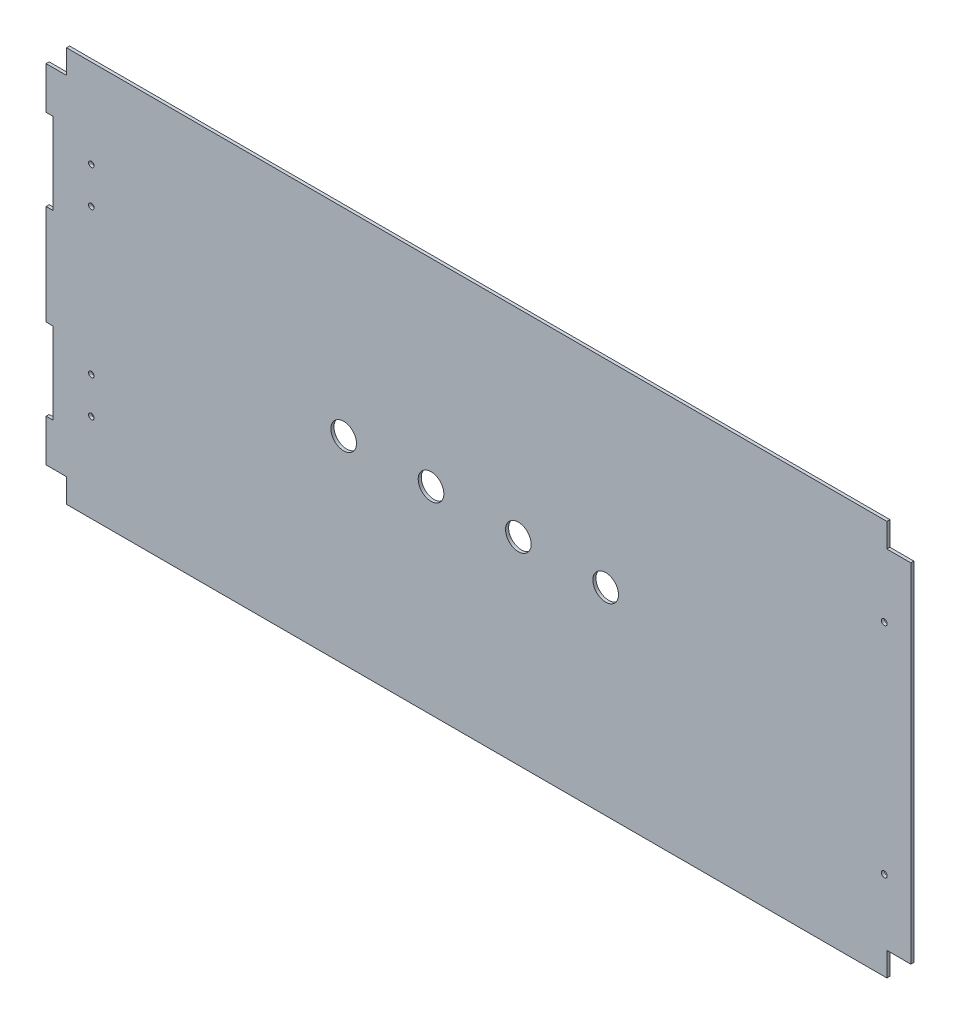
ISO-10303-21;
HEADER;
FILE_DESCRIPTION(('STEP AP214'),'2;1');
FILE_NAME('part.step','',(''),(''),'','','');
FILE_SCHEMA(('AUTOMOTIVE_DESIGN { 1 0 10303 214 1 1 1 1 }'));
ENDSEC;
DATA;
#1=APPLICATION_CONTEXT('core data for automotive mechanical design processes');
#2=APPLICATION_PROTOCOL_DEFINITION('international standard','automotive_design',2000,#1);
#3=PRODUCT_CONTEXT('',#1,'mechanical');
#4=PRODUCT('Part','Part','',(#3));
#5=PRODUCT_RELATED_PRODUCT_CATEGORY('part','',(#4));
#6=PRODUCT_DEFINITION_FORMATION('','',#4);
#7=PRODUCT_DEFINITION_CONTEXT('part definition',#1,'design');
#8=PRODUCT_DEFINITION('design','',#6,#7);
#9=PRODUCT_DEFINITION_SHAPE('','',#8);
#10=(LENGTH_UNIT() NAMED_UNIT(*) SI_UNIT(.MILLI.,.METRE.));
#11=(NAMED_UNIT(*) PLANE_ANGLE_UNIT() SI_UNIT($,.RADIAN.));
#12=(NAMED_UNIT(*) SI_UNIT($,.STERADIAN.) SOLID_ANGLE_UNIT());
#13=UNCERTAINTY_MEASURE_WITH_UNIT(LENGTH_MEASURE(1.E-05),#10,'distance_accuracy_value','');
#14=(GEOMETRIC_REPRESENTATION_CONTEXT(3) GLOBAL_UNCERTAINTY_ASSIGNED_CONTEXT((#13)) GLOBAL_UNIT_ASSIGNED_CONTEXT((#10,
#11,#12)) REPRESENTATION_CONTEXT('',''));
#15=CARTESIAN_POINT('',(0.,0.,0.));
#16=DIRECTION('',(0.,0.,1.));
#17=DIRECTION('',(1.,0.,0.));
#18=AXIS2_PLACEMENT_3D('',#15,#16,#17);
#19=CARTESIAN_POINT('',(0.,0.,-2.667));
#20=DIRECTION('',(0.,0.,-1.));
#21=DIRECTION('',(-1.,0.,0.));
#22=AXIS2_PLACEMENT_3D('',#19,#20,#21);
#23=PLANE('',#22);
#24=CARTESIAN_POINT('',(357.251,-95.25,-2.667));
#25=DIRECTION('',(0.,0.,1.));
#26=DIRECTION('',(1.,0.,0.));
#27=AXIS2_PLACEMENT_3D('',#24,#25,#26);
#28=CIRCLE('',#27,2.54000000000001);
#29=CARTESIAN_POINT('',(359.791,-95.25,-2.667));
#30=VERTEX_POINT('',#29);
#31=EDGE_CURVE('E415',#30,#30,#28,.T.);
#32=ORIENTED_EDGE('',*,*,#31,.T.);
#33=EDGE_LOOP('',(#32));
#34=FACE_BOUND('',#33,.T.);
#35=CARTESIAN_POINT('',(-334.645,-63.5,-2.667));
#36=DIRECTION('',(0.,0.,1.));
#37=DIRECTION('',(1.,0.,0.));
#38=AXIS2_PLACEMENT_3D('',#35,#36,#37);
#39=CIRCLE('',#38,2.41299999999999);
#40=CARTESIAN_POINT('',(-332.232,-63.5,-2.667));
#41=VERTEX_POINT('',#40);
#42=EDGE_CURVE('E402',#41,#41,#39,.T.);
#43=ORIENTED_EDGE('',*,*,#42,.T.);
#44=EDGE_LOOP('',(#43));
#45=FACE_BOUND('',#44,.T.);
#46=CARTESIAN_POINT('',(-334.645,63.5,-2.667));
#47=DIRECTION('',(0.,0.,1.));
#48=DIRECTION('',(1.,0.,0.));
#49=AXIS2_PLACEMENT_3D('',#46,#47,#48);
#50=CIRCLE('',#49,2.41299999999999);
#51=CARTESIAN_POINT('',(-332.232,63.5,-2.667));
#52=VERTEX_POINT('',#51);
#53=EDGE_CURVE('E403',#52,#52,#50,.T.);
#54=ORIENTED_EDGE('',*,*,#53,.T.);
#55=EDGE_LOOP('',(#54));
#56=FACE_BOUND('',#55,.T.);
#57=CARTESIAN_POINT('',(-334.645,-95.25,-2.667));
#58=DIRECTION('',(0.,0.,1.));
#59=DIRECTION('',(1.,0.,0.));
#60=AXIS2_PLACEMENT_3D('',#57,#58,#59);
#61=CIRCLE('',#60,2.41299999999999);
#62=CARTESIAN_POINT('',(-332.232,-95.25,-2.667));
#63=VERTEX_POINT('',#62);
#64=EDGE_CURVE('E396',#63,#63,#61,.T.);
#65=ORIENTED_EDGE('',*,*,#64,.T.);
#66=EDGE_LOOP('',(#65));
#67=FACE_BOUND('',#66,.T.);
#68=CARTESIAN_POINT('',(357.251,95.2499999999999,-2.667));
#69=DIRECTION('',(0.,0.,1.));
#70=DIRECTION('',(1.,0.,0.));
#71=AXIS2_PLACEMENT_3D('',#68,#69,#70);
#72=CIRCLE('',#71,2.54000000000001);
#73=CARTESIAN_POINT('',(359.791,95.2499999999999,-2.667));
#74=VERTEX_POINT('',#73);
#75=EDGE_CURVE('E414',#74,#74,#72,.T.);
#76=ORIENTED_EDGE('',*,*,#75,.T.);
#77=EDGE_LOOP('',(#76));
#78=FACE_BOUND('',#77,.T.);
#79=CARTESIAN_POINT('',(114.173,0.,-2.667));
#80=DIRECTION('',(0.,0.,1.));
#81=DIRECTION('',(1.,0.,0.));
#82=AXIS2_PLACEMENT_3D('',#79,#80,#81);
#83=CIRCLE('',#82,11.176);
#84=CARTESIAN_POINT('',(125.349,0.,-2.667));
#85=VERTEX_POINT('',#84);
#86=EDGE_CURVE('E439',#85,#85,#83,.T.);
#87=ORIENTED_EDGE('',*,*,#86,.T.);
#88=EDGE_LOOP('',(#87));
#89=FACE_BOUND('',#88,.T.);
#90=CARTESIAN_POINT('',(37.9729999999999,0.,-2.667));
#91=DIRECTION('',(0.,0.,1.));
#92=DIRECTION('',(1.,0.,0.));
#93=AXIS2_PLACEMENT_3D('',#90,#91,#92);
#94=CIRCLE('',#93,11.176);
#95=CARTESIAN_POINT('',(49.1489999999999,0.,-2.667));
#96=VERTEX_POINT('',#95);
#97=EDGE_CURVE('E433',#96,#96,#94,.T.);
#98=ORIENTED_EDGE('',*,*,#97,.T.);
#99=EDGE_LOOP('',(#98));
#100=FACE_BOUND('',#99,.T.);
#101=CARTESIAN_POINT('',(-38.2270000000001,0.,-2.667));
#102=DIRECTION('',(0.,0.,1.));
#103=DIRECTION('',(1.,0.,0.));
#104=AXIS2_PLACEMENT_3D('',#101,#102,#103);
#105=CIRCLE('',#104,11.176);
#106=CARTESIAN_POINT('',(-27.0510000000001,0.,-2.667));
#107=VERTEX_POINT('',#106);
#108=EDGE_CURVE('E427',#107,#107,#105,.T.);
#109=ORIENTED_EDGE('',*,*,#108,.T.);
#110=EDGE_LOOP('',(#109));
#111=FACE_BOUND('',#110,.T.);
#112=CARTESIAN_POINT('',(-334.645,95.25,-2.667));
#113=DIRECTION('',(0.,0.,1.));
#114=DIRECTION('',(1.,0.,0.));
#115=AXIS2_PLACEMENT_3D('',#112,#113,#114);
#116=CIRCLE('',#115,2.41299999999999);
#117=CARTESIAN_POINT('',(-332.232,95.25,-2.667));
#118=VERTEX_POINT('',#117);
#119=EDGE_CURVE('E328',#118,#118,#116,.T.);
#120=ORIENTED_EDGE('',*,*,#119,.T.);
#121=EDGE_LOOP('',(#120));
#122=FACE_BOUND('',#121,.T.);
#123=CARTESIAN_POINT('',(-114.427,0.,-2.667));
#124=DIRECTION('',(0.,0.,1.));
#125=DIRECTION('',(1.,0.,0.));
#126=AXIS2_PLACEMENT_3D('',#123,#124,#125);
#127=CIRCLE('',#126,11.176);
#128=CARTESIAN_POINT('',(-103.251,0.,-2.667));
#129=VERTEX_POINT('',#128);
#130=EDGE_CURVE('E447',#129,#129,#127,.T.);
#131=ORIENTED_EDGE('',*,*,#130,.T.);
#132=EDGE_LOOP('',(#131));
#133=FACE_BOUND('',#132,.T.);
#134=DIRECTION('',(1.,0.,0.));
#135=VECTOR('',#134,1.);
#136=CARTESIAN_POINT('',(-365.887,-151.638,-2.667));
#137=LINE('',#136,#135);
#138=CARTESIAN_POINT('',(-374.075577336074,-151.638,-2.66699999999992));
#139=VERTEX_POINT('',#138);
#140=CARTESIAN_POINT('',(-356.235,-151.638,-2.667));
#141=VERTEX_POINT('',#140);
#142=EDGE_CURVE('E149',#139,#141,#137,.T.);
#143=ORIENTED_EDGE('',*,*,#142,.F.);
#144=DIRECTION('',(0.,-1.,0.));
#145=VECTOR('',#144,1.);
#146=CARTESIAN_POINT('',(-374.075577336074,0.,-2.66699999999992));
#147=LINE('',#146,#145);
#148=CARTESIAN_POINT('',(-374.075577336074,-114.808,-2.66699999999992));
#149=VERTEX_POINT('',#148);
#150=EDGE_CURVE('E333',#139,#149,#147,.F.);
#151=ORIENTED_EDGE('',*,*,#150,.T.);
#152=DIRECTION('',(1.,0.,0.));
#153=VECTOR('',#152,1.);
#154=CARTESIAN_POINT('',(-374.075577336074,-114.808,-2.66699999999992));
#155=LINE('',#154,#153);
#156=CARTESIAN_POINT('',(-368.233577336074,-114.808,-2.66699999999997));
#157=VERTEX_POINT('',#156);
#158=EDGE_CURVE('E336',#149,#157,#155,.T.);
#159=ORIENTED_EDGE('',*,*,#158,.T.);
#160=DIRECTION('',(0.,1.,0.));
#161=VECTOR('',#160,1.);
#162=CARTESIAN_POINT('',(-368.233577336074,-43.6880000000001,-2.66699999999997));
#163=LINE('',#162,#161);
#164=CARTESIAN_POINT('',(-368.233577336074,-43.6880000000001,-2.66699999999997));
#165=VERTEX_POINT('',#164);
#166=EDGE_CURVE('E341',#157,#165,#163,.T.);
#167=ORIENTED_EDGE('',*,*,#166,.T.);
#168=DIRECTION('',(-1.,0.,0.));
#169=VECTOR('',#168,1.);
#170=CARTESIAN_POINT('',(-374.075577336074,-43.6880000000001,-2.66699999999992));
#171=LINE('',#170,#169);
#172=CARTESIAN_POINT('',(-374.075577336074,-43.6880000000001,-2.66699999999992));
#173=VERTEX_POINT('',#172);
#174=EDGE_CURVE('E338',#165,#173,#171,.T.);
#175=ORIENTED_EDGE('',*,*,#174,.T.);
#176=CARTESIAN_POINT('',(-374.075577336074,43.6879999999999,-2.66699999999992));
#177=VERTEX_POINT('',#176);
#178=EDGE_CURVE('E332',#173,#177,#147,.F.);
#179=ORIENTED_EDGE('',*,*,#178,.T.);
#180=DIRECTION('',(1.,0.,0.));
#181=VECTOR('',#180,1.);
#182=CARTESIAN_POINT('',(-374.075577336074,43.6879999999999,-2.66699999999992));
#183=LINE('',#182,#181);
#184=CARTESIAN_POINT('',(-368.233577336074,43.6879999999999,-2.66699999999997));
#185=VERTEX_POINT('',#184);
#186=EDGE_CURVE('E329',#177,#185,#183,.T.);
#187=ORIENTED_EDGE('',*,*,#186,.T.);
#188=DIRECTION('',(0.,1.,0.));
#189=VECTOR('',#188,1.);
#190=CARTESIAN_POINT('',(-368.233577336074,114.808,-2.66699999999997));
#191=LINE('',#190,#189);
#192=CARTESIAN_POINT('',(-368.233577336074,114.808,-2.66699999999997));
#193=VERTEX_POINT('',#192);
#194=EDGE_CURVE('E349',#185,#193,#191,.T.);
#195=ORIENTED_EDGE('',*,*,#194,.T.);
#196=DIRECTION('',(-1.,0.,0.));
#197=VECTOR('',#196,1.);
#198=CARTESIAN_POINT('',(-374.075577336074,114.808,-2.66699999999992));
#199=LINE('',#198,#197);
#200=CARTESIAN_POINT('',(-374.075577336074,114.808,-2.66699999999992));
#201=VERTEX_POINT('',#200);
#202=EDGE_CURVE('E346',#193,#201,#199,.T.);
#203=ORIENTED_EDGE('',*,*,#202,.T.);
#204=CARTESIAN_POINT('',(-374.075577336074,151.638,-2.66699999999992));
#205=VERTEX_POINT('',#204);
#206=EDGE_CURVE('E337',#201,#205,#147,.F.);
#207=ORIENTED_EDGE('',*,*,#206,.T.);
#208=DIRECTION('',(-1.,0.,0.));
#209=VECTOR('',#208,1.);
#210=CARTESIAN_POINT('',(-365.887,151.638,-2.667));
#211=LINE('',#210,#209);
#212=CARTESIAN_POINT('',(-356.235,151.638,-2.667));
#213=VERTEX_POINT('',#212);
#214=EDGE_CURVE('E463',#213,#205,#211,.T.);
#215=ORIENTED_EDGE('',*,*,#214,.F.);
#216=DIRECTION('',(0.,-1.,0.));
#217=VECTOR('',#216,1.);
#218=CARTESIAN_POINT('',(-356.235,157.988,-2.667));
#219=LINE('',#218,#217);
#220=CARTESIAN_POINT('',(-356.235,172.526577336074,-2.66699999999992));
#221=VERTEX_POINT('',#220);
#222=EDGE_CURVE('E461',#221,#213,#219,.T.);
#223=ORIENTED_EDGE('',*,*,#222,.F.);
#224=DIRECTION('',(-1.,0.,0.));
#225=VECTOR('',#224,1.);
#226=CARTESIAN_POINT('',(0.,172.526577336074,-2.66699999999992));
#227=LINE('',#226,#225);
#228=CARTESIAN_POINT('',(359.537,172.526577336074,-2.66699999999992));
#229=VERTEX_POINT('',#228);
#230=EDGE_CURVE('E293',#221,#229,#227,.F.);
#231=ORIENTED_EDGE('',*,*,#230,.T.);
#232=DIRECTION('',(0.,1.,0.));
#233=VECTOR('',#232,1.);
#234=CARTESIAN_POINT('',(359.537,157.988,-2.667));
#235=LINE('',#234,#233);
#236=CARTESIAN_POINT('',(359.537,151.638,-2.667));
#237=VERTEX_POINT('',#236);
#238=EDGE_CURVE('E289',#237,#229,#235,.T.);
#239=ORIENTED_EDGE('',*,*,#238,.F.);
#240=DIRECTION('',(-1.,0.,0.));
#241=VECTOR('',#240,1.);
#242=CARTESIAN_POINT('',(365.887,151.638,-2.667));
#243=LINE('',#242,#241);
#244=CARTESIAN_POINT('',(380.425577336074,151.638,-2.66699999999986));
#245=VERTEX_POINT('',#244);
#246=EDGE_CURVE('E458',#245,#237,#243,.T.);
#247=ORIENTED_EDGE('',*,*,#246,.F.);
#248=DIRECTION('',(0.,-1.,0.));
#249=VECTOR('',#248,1.);
#250=CARTESIAN_POINT('',(380.425577336074,0.,-2.66699999999986));
#251=LINE('',#250,#249);
#252=CARTESIAN_POINT('',(380.425577336074,-151.638,-2.66699999999986));
#253=VERTEX_POINT('',#252);
#254=EDGE_CURVE('E318',#245,#253,#251,.T.);
#255=ORIENTED_EDGE('',*,*,#254,.T.);
#256=DIRECTION('',(1.,0.,0.));
#257=VECTOR('',#256,1.);
#258=CARTESIAN_POINT('',(365.887,-151.638,-2.667));
#259=LINE('',#258,#257);
#260=CARTESIAN_POINT('',(359.537,-151.638,-2.667));
#261=VERTEX_POINT('',#260);
#262=EDGE_CURVE('E456',#261,#253,#259,.T.);
#263=ORIENTED_EDGE('',*,*,#262,.F.);
#264=DIRECTION('',(0.,1.,0.));
#265=VECTOR('',#264,1.);
#266=CARTESIAN_POINT('',(359.537,-157.988,-2.667));
#267=LINE('',#266,#265);
#268=CARTESIAN_POINT('',(359.537,-172.526577336074,-2.66699999999995));
#269=VERTEX_POINT('',#268);
#270=EDGE_CURVE('E182',#269,#261,#267,.T.);
#271=ORIENTED_EDGE('',*,*,#270,.F.);
#272=DIRECTION('',(-1.,0.,0.));
#273=VECTOR('',#272,1.);
#274=CARTESIAN_POINT('',(0.,-172.526577336074,-2.66699999999997));
#275=LINE('',#274,#273);
#276=CARTESIAN_POINT('',(-356.235,-172.526577336074,-2.667));
#277=VERTEX_POINT('',#276);
#278=EDGE_CURVE('E305',#269,#277,#275,.T.);
#279=ORIENTED_EDGE('',*,*,#278,.T.);
#280=DIRECTION('',(0.,-1.,0.));
#281=VECTOR('',#280,1.);
#282=CARTESIAN_POINT('',(-356.235,-157.988,-2.667));
#283=LINE('',#282,#281);
#284=EDGE_CURVE('E453',#141,#277,#283,.T.);
#285=ORIENTED_EDGE('',*,*,#284,.F.);
#286=EDGE_LOOP('',(#143,#151,#159,#167,#175,#179,#187,#195,#203,#207,#215,#223,#231,#239,#247,
#255,#263,#271,#279,#285));
#287=FACE_BOUND('',#286,.T.);
#288=ADVANCED_FACE('F131',(#34,#45,#56,#67,#78,#89,#100,#111,#122,#133,#287),#23,.T.);
#289=CARTESIAN_POINT('',(0.,0.,0.));
#290=DIRECTION('',(0.,0.,-1.));
#291=DIRECTION('',(-1.,0.,0.));
#292=AXIS2_PLACEMENT_3D('',#289,#290,#291);
#293=PLANE('',#292);
#294=CARTESIAN_POINT('',(357.251,-95.25,0.));
#295=DIRECTION('',(0.,0.,1.));
#296=DIRECTION('',(1.,0.,0.));
#297=AXIS2_PLACEMENT_3D('',#294,#295,#296);
#298=CIRCLE('',#297,2.54000000000001);
#299=CARTESIAN_POINT('',(359.791,-95.25,0.));
#300=VERTEX_POINT('',#299);
#301=EDGE_CURVE('E411',#300,#300,#298,.T.);
#302=ORIENTED_EDGE('',*,*,#301,.F.);
#303=EDGE_LOOP('',(#302));
#304=FACE_BOUND('',#303,.T.);
#305=CARTESIAN_POINT('',(-334.645,-63.5,0.));
#306=DIRECTION('',(0.,0.,1.));
#307=DIRECTION('',(1.,0.,0.));
#308=AXIS2_PLACEMENT_3D('',#305,#306,#307);
#309=CIRCLE('',#308,2.41299999999999);
#310=CARTESIAN_POINT('',(-332.232,-63.5,0.));
#311=VERTEX_POINT('',#310);
#312=EDGE_CURVE('E418',#311,#311,#309,.T.);
#313=ORIENTED_EDGE('',*,*,#312,.F.);
#314=EDGE_LOOP('',(#313));
#315=FACE_BOUND('',#314,.T.);
#316=CARTESIAN_POINT('',(-334.645,63.5,0.));
#317=DIRECTION('',(0.,0.,1.));
#318=DIRECTION('',(1.,0.,0.));
#319=AXIS2_PLACEMENT_3D('',#316,#317,#318);
#320=CIRCLE('',#319,2.41299999999999);
#321=CARTESIAN_POINT('',(-332.232,63.5,0.));
#322=VERTEX_POINT('',#321);
#323=EDGE_CURVE('E399',#322,#322,#320,.T.);
#324=ORIENTED_EDGE('',*,*,#323,.F.);
#325=EDGE_LOOP('',(#324));
#326=FACE_BOUND('',#325,.T.);
#327=CARTESIAN_POINT('',(-334.645,-95.25,0.));
#328=DIRECTION('',(0.,0.,1.));
#329=DIRECTION('',(1.,0.,0.));
#330=AXIS2_PLACEMENT_3D('',#327,#328,#329);
#331=CIRCLE('',#330,2.41299999999999);
#332=CARTESIAN_POINT('',(-332.232,-95.25,0.));
#333=VERTEX_POINT('',#332);
#334=EDGE_CURVE('E406',#333,#333,#331,.T.);
#335=ORIENTED_EDGE('',*,*,#334,.F.);
#336=EDGE_LOOP('',(#335));
#337=FACE_BOUND('',#336,.T.);
#338=CARTESIAN_POINT('',(357.251,95.2499999999999,0.));
#339=DIRECTION('',(0.,0.,1.));
#340=DIRECTION('',(1.,0.,0.));
#341=AXIS2_PLACEMENT_3D('',#338,#339,#340);
#342=CIRCLE('',#341,2.54000000000001);
#343=CARTESIAN_POINT('',(359.791,95.2499999999999,0.));
#344=VERTEX_POINT('',#343);
#345=EDGE_CURVE('E442',#344,#344,#342,.T.);
#346=ORIENTED_EDGE('',*,*,#345,.F.);
#347=EDGE_LOOP('',(#346));
#348=FACE_BOUND('',#347,.T.);
#349=CARTESIAN_POINT('',(114.173,0.,0.));
#350=DIRECTION('',(0.,0.,1.));
#351=DIRECTION('',(1.,0.,0.));
#352=AXIS2_PLACEMENT_3D('',#349,#350,#351);
#353=CIRCLE('',#352,11.176);
#354=CARTESIAN_POINT('',(125.349,0.,0.));
#355=VERTEX_POINT('',#354);
#356=EDGE_CURVE('E436',#355,#355,#353,.T.);
#357=ORIENTED_EDGE('',*,*,#356,.F.);
#358=EDGE_LOOP('',(#357));
#359=FACE_BOUND('',#358,.T.);
#360=CARTESIAN_POINT('',(37.9729999999999,0.,0.));
#361=DIRECTION('',(0.,0.,1.));
#362=DIRECTION('',(1.,0.,0.));
#363=AXIS2_PLACEMENT_3D('',#360,#361,#362);
#364=CIRCLE('',#363,11.176);
#365=CARTESIAN_POINT('',(49.1489999999999,0.,0.));
#366=VERTEX_POINT('',#365);
#367=EDGE_CURVE('E430',#366,#366,#364,.T.);
#368=ORIENTED_EDGE('',*,*,#367,.F.);
#369=EDGE_LOOP('',(#368));
#370=FACE_BOUND('',#369,.T.);
#371=CARTESIAN_POINT('',(-38.2270000000001,0.,0.));
#372=DIRECTION('',(0.,0.,1.));
#373=DIRECTION('',(1.,0.,0.));
#374=AXIS2_PLACEMENT_3D('',#371,#372,#373);
#375=CIRCLE('',#374,11.176);
#376=CARTESIAN_POINT('',(-27.0510000000001,0.,0.));
#377=VERTEX_POINT('',#376);
#378=EDGE_CURVE('E423',#377,#377,#375,.T.);
#379=ORIENTED_EDGE('',*,*,#378,.F.);
#380=EDGE_LOOP('',(#379));
#381=FACE_BOUND('',#380,.T.);
#382=CARTESIAN_POINT('',(-334.645,95.25,0.));
#383=DIRECTION('',(0.,0.,1.));
#384=DIRECTION('',(1.,0.,0.));
#385=AXIS2_PLACEMENT_3D('',#382,#383,#384);
#386=CIRCLE('',#385,2.41299999999999);
#387=CARTESIAN_POINT('',(-332.232,95.25,0.));
#388=VERTEX_POINT('',#387);
#389=EDGE_CURVE('E393',#388,#388,#386,.T.);
#390=ORIENTED_EDGE('',*,*,#389,.F.);
#391=EDGE_LOOP('',(#390));
#392=FACE_BOUND('',#391,.T.);
#393=CARTESIAN_POINT('',(-114.427,0.,0.));
#394=DIRECTION('',(0.,0.,1.));
#395=DIRECTION('',(1.,0.,0.));
#396=AXIS2_PLACEMENT_3D('',#393,#394,#395);
#397=CIRCLE('',#396,11.176);
#398=CARTESIAN_POINT('',(-103.251,0.,0.));
#399=VERTEX_POINT('',#398);
#400=EDGE_CURVE('E426',#399,#399,#397,.T.);
#401=ORIENTED_EDGE('',*,*,#400,.F.);
#402=EDGE_LOOP('',(#401));
#403=FACE_BOUND('',#402,.T.);
#404=DIRECTION('',(-1.,0.,0.));
#405=VECTOR('',#404,1.);
#406=CARTESIAN_POINT('',(-365.887,151.638,0.));
#407=LINE('',#406,#405);
#408=CARTESIAN_POINT('',(-356.235,151.638,0.));
#409=VERTEX_POINT('',#408);
#410=CARTESIAN_POINT('',(-374.075577336074,151.638,0.));
#411=VERTEX_POINT('',#410);
#412=EDGE_CURVE('E473',#409,#411,#407,.T.);
#413=ORIENTED_EDGE('',*,*,#412,.T.);
#414=DIRECTION('',(0.,1.,0.));
#415=VECTOR('',#414,1.);
#416=CARTESIAN_POINT('',(-374.075577336074,151.638,0.));
#417=LINE('',#416,#415);
#418=CARTESIAN_POINT('',(-374.075577336074,114.808,0.));
#419=VERTEX_POINT('',#418);
#420=EDGE_CURVE('E364',#419,#411,#417,.T.);
#421=ORIENTED_EDGE('',*,*,#420,.F.);
#422=DIRECTION('',(-1.,0.,0.));
#423=VECTOR('',#422,1.);
#424=CARTESIAN_POINT('',(-374.075577336074,114.808,0.));
#425=LINE('',#424,#423);
#426=CARTESIAN_POINT('',(-368.233577336074,114.808,0.));
#427=VERTEX_POINT('',#426);
#428=EDGE_CURVE('E359',#427,#419,#425,.T.);
#429=ORIENTED_EDGE('',*,*,#428,.F.);
#430=DIRECTION('',(0.,1.,0.));
#431=VECTOR('',#430,1.);
#432=CARTESIAN_POINT('',(-368.233577336074,114.808,0.));
#433=LINE('',#432,#431);
#434=CARTESIAN_POINT('',(-368.233577336074,43.6879999999999,0.));
#435=VERTEX_POINT('',#434);
#436=EDGE_CURVE('E354',#435,#427,#433,.T.);
#437=ORIENTED_EDGE('',*,*,#436,.F.);
#438=DIRECTION('',(1.,0.,0.));
#439=VECTOR('',#438,1.);
#440=CARTESIAN_POINT('',(-374.075577336074,43.6879999999999,0.));
#441=LINE('',#440,#439);
#442=CARTESIAN_POINT('',(-374.075577336074,43.6879999999999,0.));
#443=VERTEX_POINT('',#442);
#444=EDGE_CURVE('E317',#443,#435,#441,.T.);
#445=ORIENTED_EDGE('',*,*,#444,.F.);
#446=CARTESIAN_POINT('',(-374.075577336074,-43.6880000000001,0.));
#447=VERTEX_POINT('',#446);
#448=EDGE_CURVE('E370',#447,#443,#417,.T.);
#449=ORIENTED_EDGE('',*,*,#448,.F.);
#450=DIRECTION('',(-1.,0.,0.));
#451=VECTOR('',#450,1.);
#452=CARTESIAN_POINT('',(-374.075577336074,-43.6880000000001,0.));
#453=LINE('',#452,#451);
#454=CARTESIAN_POINT('',(-368.233577336074,-43.6880000000001,0.));
#455=VERTEX_POINT('',#454);
#456=EDGE_CURVE('E384',#455,#447,#453,.T.);
#457=ORIENTED_EDGE('',*,*,#456,.F.);
#458=DIRECTION('',(0.,1.,0.));
#459=VECTOR('',#458,1.);
#460=CARTESIAN_POINT('',(-368.233577336074,-43.6880000000001,0.));
#461=LINE('',#460,#459);
#462=CARTESIAN_POINT('',(-368.233577336074,-114.808,0.));
#463=VERTEX_POINT('',#462);
#464=EDGE_CURVE('E379',#463,#455,#461,.T.);
#465=ORIENTED_EDGE('',*,*,#464,.F.);
#466=DIRECTION('',(1.,0.,0.));
#467=VECTOR('',#466,1.);
#468=CARTESIAN_POINT('',(-374.075577336074,-114.808,0.));
#469=LINE('',#468,#467);
#470=CARTESIAN_POINT('',(-374.075577336074,-114.808,0.));
#471=VERTEX_POINT('',#470);
#472=EDGE_CURVE('E374',#471,#463,#469,.T.);
#473=ORIENTED_EDGE('',*,*,#472,.F.);
#474=CARTESIAN_POINT('',(-374.075577336074,-151.638,0.));
#475=VERTEX_POINT('',#474);
#476=EDGE_CURVE('E365',#475,#471,#417,.T.);
#477=ORIENTED_EDGE('',*,*,#476,.F.);
#478=DIRECTION('',(1.,0.,0.));
#479=VECTOR('',#478,1.);
#480=CARTESIAN_POINT('',(-365.887,-151.638,0.));
#481=LINE('',#480,#479);
#482=CARTESIAN_POINT('',(-356.235,-151.638,0.));
#483=VERTEX_POINT('',#482);
#484=EDGE_CURVE('E175',#475,#483,#481,.T.);
#485=ORIENTED_EDGE('',*,*,#484,.T.);
#486=DIRECTION('',(0.,-1.,0.));
#487=VECTOR('',#486,1.);
#488=CARTESIAN_POINT('',(-356.235,-157.988,0.));
#489=LINE('',#488,#487);
#490=CARTESIAN_POINT('',(-356.235,-172.526577336074,0.));
#491=VERTEX_POINT('',#490);
#492=EDGE_CURVE('E450',#483,#491,#489,.T.);
#493=ORIENTED_EDGE('',*,*,#492,.T.);
#494=DIRECTION('',(1.,0.,0.));
#495=VECTOR('',#494,1.);
#496=CARTESIAN_POINT('',(359.537,-172.526577336074,0.));
#497=LINE('',#496,#495);
#498=CARTESIAN_POINT('',(359.537,-172.526577336074,0.));
#499=VERTEX_POINT('',#498);
#500=EDGE_CURVE('E311',#499,#491,#497,.F.);
#501=ORIENTED_EDGE('',*,*,#500,.F.);
#502=DIRECTION('',(0.,1.,0.));
#503=VECTOR('',#502,1.);
#504=CARTESIAN_POINT('',(359.537,-157.988,0.));
#505=LINE('',#504,#503);
#506=CARTESIAN_POINT('',(359.537,-151.638,0.));
#507=VERTEX_POINT('',#506);
#508=EDGE_CURVE('E467',#499,#507,#505,.T.);
#509=ORIENTED_EDGE('',*,*,#508,.T.);
#510=DIRECTION('',(1.,0.,0.));
#511=VECTOR('',#510,1.);
#512=CARTESIAN_POINT('',(365.887,-151.638,0.));
#513=LINE('',#512,#511);
#514=CARTESIAN_POINT('',(380.425577336074,-151.638,1.11022302462516E-13));
#515=VERTEX_POINT('',#514);
#516=EDGE_CURVE('E469',#507,#515,#513,.T.);
#517=ORIENTED_EDGE('',*,*,#516,.T.);
#518=DIRECTION('',(0.,1.,0.));
#519=VECTOR('',#518,1.);
#520=CARTESIAN_POINT('',(380.425577336074,151.638,1.11022302462516E-13));
#521=LINE('',#520,#519);
#522=CARTESIAN_POINT('',(380.425577336074,151.638,1.11022302462516E-13));
#523=VERTEX_POINT('',#522);
#524=EDGE_CURVE('E304',#523,#515,#521,.F.);
#525=ORIENTED_EDGE('',*,*,#524,.F.);
#526=DIRECTION('',(-1.,0.,0.));
#527=VECTOR('',#526,1.);
#528=CARTESIAN_POINT('',(365.887,151.638,0.));
#529=LINE('',#528,#527);
#530=CARTESIAN_POINT('',(359.537,151.638,0.));
#531=VERTEX_POINT('',#530);
#532=EDGE_CURVE('E280',#523,#531,#529,.T.);
#533=ORIENTED_EDGE('',*,*,#532,.T.);
#534=DIRECTION('',(0.,1.,0.));
#535=VECTOR('',#534,1.);
#536=CARTESIAN_POINT('',(359.537,157.988,0.));
#537=LINE('',#536,#535);
#538=CARTESIAN_POINT('',(359.537,172.526577336074,1.11022302462516E-13));
#539=VERTEX_POINT('',#538);
#540=EDGE_CURVE('E275',#531,#539,#537,.T.);
#541=ORIENTED_EDGE('',*,*,#540,.T.);
#542=DIRECTION('',(1.,0.,0.));
#543=VECTOR('',#542,1.);
#544=CARTESIAN_POINT('',(359.537,172.526577336074,1.11022302462516E-13));
#545=LINE('',#544,#543);
#546=CARTESIAN_POINT('',(-356.235,172.526577336074,0.));
#547=VERTEX_POINT('',#546);
#548=EDGE_CURVE('E278',#547,#539,#545,.T.);
#549=ORIENTED_EDGE('',*,*,#548,.F.);
#550=DIRECTION('',(0.,-1.,0.));
#551=VECTOR('',#550,1.);
#552=CARTESIAN_POINT('',(-356.235,157.988,0.));
#553=LINE('',#552,#551);
#554=EDGE_CURVE('E168',#547,#409,#553,.T.);
#555=ORIENTED_EDGE('',*,*,#554,.T.);
#556=EDGE_LOOP('',(#413,#421,#429,#437,#445,#449,#457,#465,#473,#477,#485,#493,#501,#509,#517,
#525,#533,#541,#549,#555));
#557=FACE_BOUND('',#556,.T.);
#558=ADVANCED_FACE('F133',(#304,#315,#326,#337,#348,#359,#370,#381,#392,#403,#557),#293,.F.);
#559=CARTESIAN_POINT('',(-365.887,151.638,-2.667));
#560=DIRECTION('',(0.,1.,0.));
#561=DIRECTION('',(-1.,0.,0.));
#562=AXIS2_PLACEMENT_3D('',#559,#560,#561);
#563=PLANE('',#562);
#564=ORIENTED_EDGE('',*,*,#214,.T.);
#565=DIRECTION('',(0.,0.,-1.));
#566=VECTOR('',#565,1.);
#567=CARTESIAN_POINT('',(-374.075577336074,151.638,0.));
#568=LINE('',#567,#566);
#569=EDGE_CURVE('E361',#411,#205,#568,.T.);
#570=ORIENTED_EDGE('',*,*,#569,.F.);
#571=ORIENTED_EDGE('',*,*,#412,.F.);
#572=DIRECTION('',(0.,0.,1.));
#573=VECTOR('',#572,1.);
#574=CARTESIAN_POINT('',(-356.235,151.638,-2.667));
#575=LINE('',#574,#573);
#576=EDGE_CURVE('E141',#213,#409,#575,.T.);
#577=ORIENTED_EDGE('',*,*,#576,.F.);
#578=EDGE_LOOP('',(#564,#570,#571,#577));
#579=FACE_BOUND('',#578,.T.);
#580=ADVANCED_FACE('F506',(#579),#563,.T.);
#581=CARTESIAN_POINT('',(365.887,-151.638,-2.667));
#582=DIRECTION('',(0.,-1.,0.));
#583=DIRECTION('',(0.,0.,-1.));
#584=AXIS2_PLACEMENT_3D('',#581,#582,#583);
#585=PLANE('',#584);
#586=ORIENTED_EDGE('',*,*,#262,.T.);
#587=DIRECTION('',(0.,0.,-1.));
#588=VECTOR('',#587,1.);
#589=CARTESIAN_POINT('',(380.425577336074,-151.638,1.11022302462516E-13));
#590=LINE('',#589,#588);
#591=EDGE_CURVE('E321',#515,#253,#590,.T.);
#592=ORIENTED_EDGE('',*,*,#591,.F.);
#593=ORIENTED_EDGE('',*,*,#516,.F.);
#594=DIRECTION('',(0.,0.,1.));
#595=VECTOR('',#594,1.);
#596=CARTESIAN_POINT('',(359.537,-151.638,-2.667));
#597=LINE('',#596,#595);
#598=EDGE_CURVE('E135',#261,#507,#597,.T.);
#599=ORIENTED_EDGE('',*,*,#598,.F.);
#600=EDGE_LOOP('',(#586,#592,#593,#599));
#601=FACE_BOUND('',#600,.T.);
#602=ADVANCED_FACE('F484',(#601),#585,.T.);
#603=CARTESIAN_POINT('',(-356.235,-157.988,-2.667));
#604=DIRECTION('',(-1.,0.,0.));
#605=DIRECTION('',(0.,0.,1.));
#606=AXIS2_PLACEMENT_3D('',#603,#604,#605);
#607=PLANE('',#606);
#608=ORIENTED_EDGE('',*,*,#284,.T.);
#609=DIRECTION('',(0.,0.,-1.));
#610=VECTOR('',#609,1.);
#611=CARTESIAN_POINT('',(-356.235,-172.526577336074,0.));
#612=LINE('',#611,#610);
#613=EDGE_CURVE('E308',#491,#277,#612,.T.);
#614=ORIENTED_EDGE('',*,*,#613,.F.);
#615=ORIENTED_EDGE('',*,*,#492,.F.);
#616=DIRECTION('',(0.,0.,1.));
#617=VECTOR('',#616,1.);
#618=CARTESIAN_POINT('',(-356.235,-151.638,-2.667));
#619=LINE('',#618,#617);
#620=EDGE_CURVE('E13',#141,#483,#619,.T.);
#621=ORIENTED_EDGE('',*,*,#620,.F.);
#622=EDGE_LOOP('',(#608,#614,#615,#621));
#623=FACE_BOUND('',#622,.T.);
#624=ADVANCED_FACE('F564',(#623),#607,.T.);
#625=CARTESIAN_POINT('',(359.537,157.988,-2.667));
#626=DIRECTION('',(1.,0.,0.));
#627=DIRECTION('',(0.,0.,-1.));
#628=AXIS2_PLACEMENT_3D('',#625,#626,#627);
#629=PLANE('',#628);
#630=ORIENTED_EDGE('',*,*,#238,.T.);
#631=DIRECTION('',(0.,0.,-1.));
#632=VECTOR('',#631,1.);
#633=CARTESIAN_POINT('',(359.537,172.526577336074,1.11022302462516E-13));
#634=LINE('',#633,#632);
#635=EDGE_CURVE('E286',#539,#229,#634,.T.);
#636=ORIENTED_EDGE('',*,*,#635,.F.);
#637=ORIENTED_EDGE('',*,*,#540,.F.);
#638=DIRECTION('',(0.,0.,1.));
#639=VECTOR('',#638,1.);
#640=CARTESIAN_POINT('',(359.537,151.638,-2.667));
#641=LINE('',#640,#639);
#642=EDGE_CURVE('E476',#237,#531,#641,.T.);
#643=ORIENTED_EDGE('',*,*,#642,.F.);
#644=EDGE_LOOP('',(#630,#636,#637,#643));
#645=FACE_BOUND('',#644,.T.);
#646=ADVANCED_FACE('F287',(#645),#629,.T.);
#647=CARTESIAN_POINT('',(-365.887,-151.638,-2.667));
#648=DIRECTION('',(0.,-1.,0.));
#649=DIRECTION('',(0.,0.,-1.));
#650=AXIS2_PLACEMENT_3D('',#647,#648,#649);
#651=PLANE('',#650);
#652=ORIENTED_EDGE('',*,*,#484,.F.);
#653=DIRECTION('',(0.,0.,-1.));
#654=VECTOR('',#653,1.);
#655=CARTESIAN_POINT('',(-374.075577336074,-151.638,0.));
#656=LINE('',#655,#654);
#657=EDGE_CURVE('E326',#475,#139,#656,.T.);
#658=ORIENTED_EDGE('',*,*,#657,.T.);
#659=ORIENTED_EDGE('',*,*,#142,.T.);
#660=ORIENTED_EDGE('',*,*,#620,.T.);
#661=EDGE_LOOP('',(#652,#658,#659,#660));
#662=FACE_BOUND('',#661,.T.);
#663=ADVANCED_FACE('F555',(#662),#651,.T.);
#664=CARTESIAN_POINT('',(-356.235,157.988,-2.667));
#665=DIRECTION('',(-1.,0.,0.));
#666=DIRECTION('',(0.,-1.,0.));
#667=AXIS2_PLACEMENT_3D('',#664,#665,#666);
#668=PLANE('',#667);
#669=ORIENTED_EDGE('',*,*,#554,.F.);
#670=DIRECTION('',(0.,0.,-1.));
#671=VECTOR('',#670,1.);
#672=CARTESIAN_POINT('',(-356.235,172.526577336074,0.));
#673=LINE('',#672,#671);
#674=EDGE_CURVE('E298',#547,#221,#673,.T.);
#675=ORIENTED_EDGE('',*,*,#674,.T.);
#676=ORIENTED_EDGE('',*,*,#222,.T.);
#677=ORIENTED_EDGE('',*,*,#576,.T.);
#678=EDGE_LOOP('',(#669,#675,#676,#677));
#679=FACE_BOUND('',#678,.T.);
#680=ADVANCED_FACE('F501',(#679),#668,.T.);
#681=CARTESIAN_POINT('',(365.887,151.638,-2.667));
#682=DIRECTION('',(0.,1.,0.));
#683=DIRECTION('',(0.,0.,1.));
#684=AXIS2_PLACEMENT_3D('',#681,#682,#683);
#685=PLANE('',#684);
#686=ORIENTED_EDGE('',*,*,#532,.F.);
#687=DIRECTION('',(0.,0.,-1.));
#688=VECTOR('',#687,1.);
#689=CARTESIAN_POINT('',(380.425577336074,151.638,1.11022302462516E-13));
#690=LINE('',#689,#688);
#691=EDGE_CURVE('E314',#523,#245,#690,.T.);
#692=ORIENTED_EDGE('',*,*,#691,.T.);
#693=ORIENTED_EDGE('',*,*,#246,.T.);
#694=ORIENTED_EDGE('',*,*,#642,.T.);
#695=EDGE_LOOP('',(#686,#692,#693,#694));
#696=FACE_BOUND('',#695,.T.);
#697=ADVANCED_FACE('F497',(#696),#685,.T.);
#698=CARTESIAN_POINT('',(359.537,-157.988,-2.667));
#699=DIRECTION('',(1.,0.,0.));
#700=DIRECTION('',(0.,0.,-1.));
#701=AXIS2_PLACEMENT_3D('',#698,#699,#700);
#702=PLANE('',#701);
#703=ORIENTED_EDGE('',*,*,#508,.F.);
#704=DIRECTION('',(0.,0.,-1.));
#705=VECTOR('',#704,1.);
#706=CARTESIAN_POINT('',(359.537,-172.526577336074,0.));
#707=LINE('',#706,#705);
#708=EDGE_CURVE('E302',#499,#269,#707,.T.);
#709=ORIENTED_EDGE('',*,*,#708,.T.);
#710=ORIENTED_EDGE('',*,*,#270,.T.);
#711=ORIENTED_EDGE('',*,*,#598,.T.);
#712=EDGE_LOOP('',(#703,#709,#710,#711));
#713=FACE_BOUND('',#712,.T.);
#714=ADVANCED_FACE('F479',(#713),#702,.T.);
#715=CARTESIAN_POINT('',(-114.427,0.,-2.667));
#716=DIRECTION('',(0.,0.,1.));
#717=DIRECTION('',(1.,0.,0.));
#718=AXIS2_PLACEMENT_3D('',#715,#716,#717);
#719=CYLINDRICAL_SURFACE('',#718,11.176);
#720=ORIENTED_EDGE('',*,*,#130,.F.);
#721=EDGE_LOOP('',(#720));
#722=FACE_BOUND('',#721,.T.);
#723=ORIENTED_EDGE('',*,*,#400,.T.);
#724=EDGE_LOOP('',(#723));
#725=FACE_BOUND('',#724,.T.);
#726=ADVANCED_FACE('F553',(#722,#725),#719,.F.);
#727=CARTESIAN_POINT('',(-334.645,95.25,-2.667));
#728=DIRECTION('',(0.,0.,1.));
#729=DIRECTION('',(1.,0.,0.));
#730=AXIS2_PLACEMENT_3D('',#727,#728,#729);
#731=CYLINDRICAL_SURFACE('',#730,2.41299999999999);
#732=ORIENTED_EDGE('',*,*,#119,.F.);
#733=EDGE_LOOP('',(#732));
#734=FACE_BOUND('',#733,.T.);
#735=ORIENTED_EDGE('',*,*,#389,.T.);
#736=EDGE_LOOP('',(#735));
#737=FACE_BOUND('',#736,.T.);
#738=ADVANCED_FACE('F809',(#734,#737),#731,.F.);
#739=CARTESIAN_POINT('',(-38.2270000000001,0.,-2.667));
#740=DIRECTION('',(0.,0.,1.));
#741=DIRECTION('',(1.,0.,0.));
#742=AXIS2_PLACEMENT_3D('',#739,#740,#741);
#743=CYLINDRICAL_SURFACE('',#742,11.176);
#744=ORIENTED_EDGE('',*,*,#108,.F.);
#745=EDGE_LOOP('',(#744));
#746=FACE_BOUND('',#745,.T.);
#747=ORIENTED_EDGE('',*,*,#378,.T.);
#748=EDGE_LOOP('',(#747));
#749=FACE_BOUND('',#748,.T.);
#750=ADVANCED_FACE('F817',(#746,#749),#743,.F.);
#751=CARTESIAN_POINT('',(37.9729999999999,0.,-2.667));
#752=DIRECTION('',(0.,0.,1.));
#753=DIRECTION('',(1.,0.,0.));
#754=AXIS2_PLACEMENT_3D('',#751,#752,#753);
#755=CYLINDRICAL_SURFACE('',#754,11.176);
#756=ORIENTED_EDGE('',*,*,#97,.F.);
#757=EDGE_LOOP('',(#756));
#758=FACE_BOUND('',#757,.T.);
#759=ORIENTED_EDGE('',*,*,#367,.T.);
#760=EDGE_LOOP('',(#759));
#761=FACE_BOUND('',#760,.T.);
#762=ADVANCED_FACE('F825',(#758,#761),#755,.F.);
#763=CARTESIAN_POINT('',(114.173,0.,-2.667));
#764=DIRECTION('',(0.,0.,1.));
#765=DIRECTION('',(1.,0.,0.));
#766=AXIS2_PLACEMENT_3D('',#763,#764,#765);
#767=CYLINDRICAL_SURFACE('',#766,11.176);
#768=ORIENTED_EDGE('',*,*,#86,.F.);
#769=EDGE_LOOP('',(#768));
#770=FACE_BOUND('',#769,.T.);
#771=ORIENTED_EDGE('',*,*,#356,.T.);
#772=EDGE_LOOP('',(#771));
#773=FACE_BOUND('',#772,.T.);
#774=ADVANCED_FACE('F834',(#770,#773),#767,.F.);
#775=CARTESIAN_POINT('',(357.251,95.2499999999999,-2.667));
#776=DIRECTION('',(0.,0.,1.));
#777=DIRECTION('',(1.,0.,0.));
#778=AXIS2_PLACEMENT_3D('',#775,#776,#777);
#779=CYLINDRICAL_SURFACE('',#778,2.54000000000001);
#780=ORIENTED_EDGE('',*,*,#75,.F.);
#781=EDGE_LOOP('',(#780));
#782=FACE_BOUND('',#781,.T.);
#783=ORIENTED_EDGE('',*,*,#345,.T.);
#784=EDGE_LOOP('',(#783));
#785=FACE_BOUND('',#784,.T.);
#786=ADVANCED_FACE('F843',(#782,#785),#779,.F.);
#787=CARTESIAN_POINT('',(-334.645,-95.25,-2.667));
#788=DIRECTION('',(0.,0.,1.));
#789=DIRECTION('',(1.,0.,0.));
#790=AXIS2_PLACEMENT_3D('',#787,#788,#789);
#791=CYLINDRICAL_SURFACE('',#790,2.41299999999999);
#792=ORIENTED_EDGE('',*,*,#64,.F.);
#793=EDGE_LOOP('',(#792));
#794=FACE_BOUND('',#793,.T.);
#795=ORIENTED_EDGE('',*,*,#334,.T.);
#796=EDGE_LOOP('',(#795));
#797=FACE_BOUND('',#796,.T.);
#798=ADVANCED_FACE('F852',(#794,#797),#791,.F.);
#799=CARTESIAN_POINT('',(-334.645,63.5,-2.667));
#800=DIRECTION('',(0.,0.,1.));
#801=DIRECTION('',(1.,0.,0.));
#802=AXIS2_PLACEMENT_3D('',#799,#800,#801);
#803=CYLINDRICAL_SURFACE('',#802,2.41299999999999);
#804=ORIENTED_EDGE('',*,*,#53,.F.);
#805=EDGE_LOOP('',(#804));
#806=FACE_BOUND('',#805,.T.);
#807=ORIENTED_EDGE('',*,*,#323,.T.);
#808=EDGE_LOOP('',(#807));
#809=FACE_BOUND('',#808,.T.);
#810=ADVANCED_FACE('F860',(#806,#809),#803,.F.);
#811=CARTESIAN_POINT('',(-334.645,-63.5,-2.667));
#812=DIRECTION('',(0.,0.,1.));
#813=DIRECTION('',(1.,0.,0.));
#814=AXIS2_PLACEMENT_3D('',#811,#812,#813);
#815=CYLINDRICAL_SURFACE('',#814,2.41299999999999);
#816=ORIENTED_EDGE('',*,*,#42,.F.);
#817=EDGE_LOOP('',(#816));
#818=FACE_BOUND('',#817,.T.);
#819=ORIENTED_EDGE('',*,*,#312,.T.);
#820=EDGE_LOOP('',(#819));
#821=FACE_BOUND('',#820,.T.);
#822=ADVANCED_FACE('F869',(#818,#821),#815,.F.);
#823=CARTESIAN_POINT('',(357.251,-95.25,-2.667));
#824=DIRECTION('',(0.,0.,1.));
#825=DIRECTION('',(1.,0.,0.));
#826=AXIS2_PLACEMENT_3D('',#823,#824,#825);
#827=CYLINDRICAL_SURFACE('',#826,2.54000000000001);
#828=ORIENTED_EDGE('',*,*,#31,.F.);
#829=EDGE_LOOP('',(#828));
#830=FACE_BOUND('',#829,.T.);
#831=ORIENTED_EDGE('',*,*,#301,.T.);
#832=EDGE_LOOP('',(#831));
#833=FACE_BOUND('',#832,.T.);
#834=ADVANCED_FACE('F878',(#830,#833),#827,.F.);
#835=CARTESIAN_POINT('',(-374.075577336074,43.6879999999999,-2.66699999999992));
#836=DIRECTION('',(0.,-1.,0.));
#837=DIRECTION('',(-1.,0.,0.));
#838=AXIS2_PLACEMENT_3D('',#835,#836,#837);
#839=PLANE('',#838);
#840=ORIENTED_EDGE('',*,*,#444,.T.);
#841=DIRECTION('',(0.,0.,1.));
#842=VECTOR('',#841,1.);
#843=CARTESIAN_POINT('',(-368.233577336074,43.6879999999999,-2.66699999999997));
#844=LINE('',#843,#842);
#845=EDGE_CURVE('E352',#185,#435,#844,.T.);
#846=ORIENTED_EDGE('',*,*,#845,.F.);
#847=ORIENTED_EDGE('',*,*,#186,.F.);
#848=DIRECTION('',(0.,0.,1.));
#849=VECTOR('',#848,1.);
#850=CARTESIAN_POINT('',(-374.075577336074,43.6879999999999,-2.66699999999992));
#851=LINE('',#850,#849);
#852=EDGE_CURVE('E389',#177,#443,#851,.T.);
#853=ORIENTED_EDGE('',*,*,#852,.T.);
#854=EDGE_LOOP('',(#840,#846,#847,#853));
#855=FACE_BOUND('',#854,.T.);
#856=ADVANCED_FACE('F525',(#855),#839,.F.);
#857=CARTESIAN_POINT('',(-374.075577336074,151.638,0.));
#858=DIRECTION('',(-1.,0.,0.));
#859=DIRECTION('',(0.,0.,1.));
#860=AXIS2_PLACEMENT_3D('',#857,#858,#859);
#861=PLANE('',#860);
#862=ORIENTED_EDGE('',*,*,#852,.F.);
#863=ORIENTED_EDGE('',*,*,#178,.F.);
#864=DIRECTION('',(0.,0.,1.));
#865=VECTOR('',#864,1.);
#866=CARTESIAN_POINT('',(-374.075577336074,-43.6880000000001,-2.66699999999992));
#867=LINE('',#866,#865);
#868=EDGE_CURVE('E386',#173,#447,#867,.T.);
#869=ORIENTED_EDGE('',*,*,#868,.T.);
#870=ORIENTED_EDGE('',*,*,#448,.T.);
#871=EDGE_LOOP('',(#862,#863,#869,#870));
#872=FACE_BOUND('',#871,.T.);
#873=ADVANCED_FACE('F517',(#872),#861,.T.);
#874=CARTESIAN_POINT('',(-374.075577336074,-43.6880000000001,-2.66699999999992));
#875=DIRECTION('',(0.,1.,0.));
#876=DIRECTION('',(1.,0.,0.));
#877=AXIS2_PLACEMENT_3D('',#874,#875,#876);
#878=PLANE('',#877);
#879=ORIENTED_EDGE('',*,*,#456,.T.);
#880=ORIENTED_EDGE('',*,*,#868,.F.);
#881=ORIENTED_EDGE('',*,*,#174,.F.);
#882=DIRECTION('',(0.,0.,1.));
#883=VECTOR('',#882,1.);
#884=CARTESIAN_POINT('',(-368.233577336074,-43.6880000000001,-2.66699999999997));
#885=LINE('',#884,#883);
#886=EDGE_CURVE('E382',#165,#455,#885,.T.);
#887=ORIENTED_EDGE('',*,*,#886,.T.);
#888=EDGE_LOOP('',(#879,#880,#881,#887));
#889=FACE_BOUND('',#888,.T.);
#890=ADVANCED_FACE('F586',(#889),#878,.F.);
#891=CARTESIAN_POINT('',(-368.233577336074,-43.6880000000001,-2.66699999999997));
#892=DIRECTION('',(1.,0.,0.));
#893=DIRECTION('',(0.,0.,-1.));
#894=AXIS2_PLACEMENT_3D('',#891,#892,#893);
#895=PLANE('',#894);
#896=ORIENTED_EDGE('',*,*,#464,.T.);
#897=ORIENTED_EDGE('',*,*,#886,.F.);
#898=ORIENTED_EDGE('',*,*,#166,.F.);
#899=DIRECTION('',(0.,0.,1.));
#900=VECTOR('',#899,1.);
#901=CARTESIAN_POINT('',(-368.233577336074,-114.808,-2.66699999999997));
#902=LINE('',#901,#900);
#903=EDGE_CURVE('E377',#157,#463,#902,.T.);
#904=ORIENTED_EDGE('',*,*,#903,.T.);
#905=EDGE_LOOP('',(#896,#897,#898,#904));
#906=FACE_BOUND('',#905,.T.);
#907=ADVANCED_FACE('F584',(#906),#895,.F.);
#908=CARTESIAN_POINT('',(-374.075577336074,-114.808,-2.66699999999992));
#909=DIRECTION('',(0.,-1.,0.));
#910=DIRECTION('',(-1.,0.,0.));
#911=AXIS2_PLACEMENT_3D('',#908,#909,#910);
#912=PLANE('',#911);
#913=ORIENTED_EDGE('',*,*,#472,.T.);
#914=ORIENTED_EDGE('',*,*,#903,.F.);
#915=ORIENTED_EDGE('',*,*,#158,.F.);
#916=DIRECTION('',(0.,0.,1.));
#917=VECTOR('',#916,1.);
#918=CARTESIAN_POINT('',(-374.075577336074,-114.808,-2.66699999999992));
#919=LINE('',#918,#917);
#920=EDGE_CURVE('E369',#149,#471,#919,.T.);
#921=ORIENTED_EDGE('',*,*,#920,.T.);
#922=EDGE_LOOP('',(#913,#914,#915,#921));
#923=FACE_BOUND('',#922,.T.);
#924=ADVANCED_FACE('F581',(#923),#912,.F.);
#925=ORIENTED_EDGE('',*,*,#920,.F.);
#926=ORIENTED_EDGE('',*,*,#150,.F.);
#927=ORIENTED_EDGE('',*,*,#657,.F.);
#928=ORIENTED_EDGE('',*,*,#476,.T.);
#929=EDGE_LOOP('',(#925,#926,#927,#928));
#930=FACE_BOUND('',#929,.T.);
#931=ADVANCED_FACE('F578',(#930),#861,.T.);
#932=DIRECTION('',(0.,0.,1.));
#933=VECTOR('',#932,1.);
#934=CARTESIAN_POINT('',(-374.075577336074,114.808,-2.66699999999992));
#935=LINE('',#934,#933);
#936=EDGE_CURVE('E368',#201,#419,#935,.T.);
#937=ORIENTED_EDGE('',*,*,#936,.T.);
#938=ORIENTED_EDGE('',*,*,#420,.T.);
#939=ORIENTED_EDGE('',*,*,#569,.T.);
#940=ORIENTED_EDGE('',*,*,#206,.F.);
#941=EDGE_LOOP('',(#937,#938,#939,#940));
#942=FACE_BOUND('',#941,.T.);
#943=ADVANCED_FACE('F511',(#942),#861,.T.);
#944=CARTESIAN_POINT('',(-374.075577336074,114.808,-2.66699999999992));
#945=DIRECTION('',(0.,1.,0.));
#946=DIRECTION('',(1.,0.,0.));
#947=AXIS2_PLACEMENT_3D('',#944,#945,#946);
#948=PLANE('',#947);
#949=ORIENTED_EDGE('',*,*,#428,.T.);
#950=ORIENTED_EDGE('',*,*,#936,.F.);
#951=ORIENTED_EDGE('',*,*,#202,.F.);
#952=DIRECTION('',(0.,0.,1.));
#953=VECTOR('',#952,1.);
#954=CARTESIAN_POINT('',(-368.233577336074,114.808,-2.66699999999997));
#955=LINE('',#954,#953);
#956=EDGE_CURVE('E357',#193,#427,#955,.T.);
#957=ORIENTED_EDGE('',*,*,#956,.T.);
#958=EDGE_LOOP('',(#949,#950,#951,#957));
#959=FACE_BOUND('',#958,.T.);
#960=ADVANCED_FACE('F531',(#959),#948,.F.);
#961=CARTESIAN_POINT('',(-368.233577336074,114.808,-2.66699999999997));
#962=DIRECTION('',(1.,0.,0.));
#963=DIRECTION('',(0.,0.,-1.));
#964=AXIS2_PLACEMENT_3D('',#961,#962,#963);
#965=PLANE('',#964);
#966=ORIENTED_EDGE('',*,*,#436,.T.);
#967=ORIENTED_EDGE('',*,*,#956,.F.);
#968=ORIENTED_EDGE('',*,*,#194,.F.);
#969=ORIENTED_EDGE('',*,*,#845,.T.);
#970=EDGE_LOOP('',(#966,#967,#968,#969));
#971=FACE_BOUND('',#970,.T.);
#972=ADVANCED_FACE('F533',(#971),#965,.F.);
#973=CARTESIAN_POINT('',(380.425577336074,151.638,1.11022302462516E-13));
#974=DIRECTION('',(1.,0.,0.));
#975=DIRECTION('',(0.,0.,-1.));
#976=AXIS2_PLACEMENT_3D('',#973,#974,#975);
#977=PLANE('',#976);
#978=ORIENTED_EDGE('',*,*,#254,.F.);
#979=ORIENTED_EDGE('',*,*,#691,.F.);
#980=ORIENTED_EDGE('',*,*,#524,.T.);
#981=ORIENTED_EDGE('',*,*,#591,.T.);
#982=EDGE_LOOP('',(#978,#979,#980,#981));
#983=FACE_BOUND('',#982,.T.);
#984=ADVANCED_FACE('F495',(#983),#977,.T.);
#985=CARTESIAN_POINT('',(359.537,-172.526577336074,0.));
#986=DIRECTION('',(0.,-1.,0.));
#987=DIRECTION('',(0.,0.,-1.));
#988=AXIS2_PLACEMENT_3D('',#985,#986,#987);
#989=PLANE('',#988);
#990=ORIENTED_EDGE('',*,*,#278,.F.);
#991=ORIENTED_EDGE('',*,*,#708,.F.);
#992=ORIENTED_EDGE('',*,*,#500,.T.);
#993=ORIENTED_EDGE('',*,*,#613,.T.);
#994=EDGE_LOOP('',(#990,#991,#992,#993));
#995=FACE_BOUND('',#994,.T.);
#996=ADVANCED_FACE('F490',(#995),#989,.T.);
#997=CARTESIAN_POINT('',(359.537,172.526577336074,1.11022302462516E-13));
#998=DIRECTION('',(0.,1.,0.));
#999=DIRECTION('',(0.,0.,1.));
#1000=AXIS2_PLACEMENT_3D('',#997,#998,#999);
#1001=PLANE('',#1000);
#1002=ORIENTED_EDGE('',*,*,#230,.F.);
#1003=ORIENTED_EDGE('',*,*,#674,.F.);
#1004=ORIENTED_EDGE('',*,*,#548,.T.);
#1005=ORIENTED_EDGE('',*,*,#635,.T.);
#1006=EDGE_LOOP('',(#1002,#1003,#1004,#1005));
#1007=FACE_BOUND('',#1006,.T.);
#1008=ADVANCED_FACE('F296',(#1007),#1001,.T.);
#1009=CLOSED_SHELL('',(#288,#558,#580,#602,#624,#646,#663,#680,#697,#714,#726,#738,#750,#762,
#774,#786,#798,#810,#822,#834,#856,#873,#890,#907,#924,#931,#943,#960,#972,#984,#996,#1008));
#1010=MANIFOLD_SOLID_BREP('B2',#1009);
#1011=ADVANCED_BREP_SHAPE_REPRESENTATION('',(#18,#1010),#14);
#1012=SHAPE_DEFINITION_REPRESENTATION(#9,#1011);
ENDSEC;
END-ISO-10303-21;
